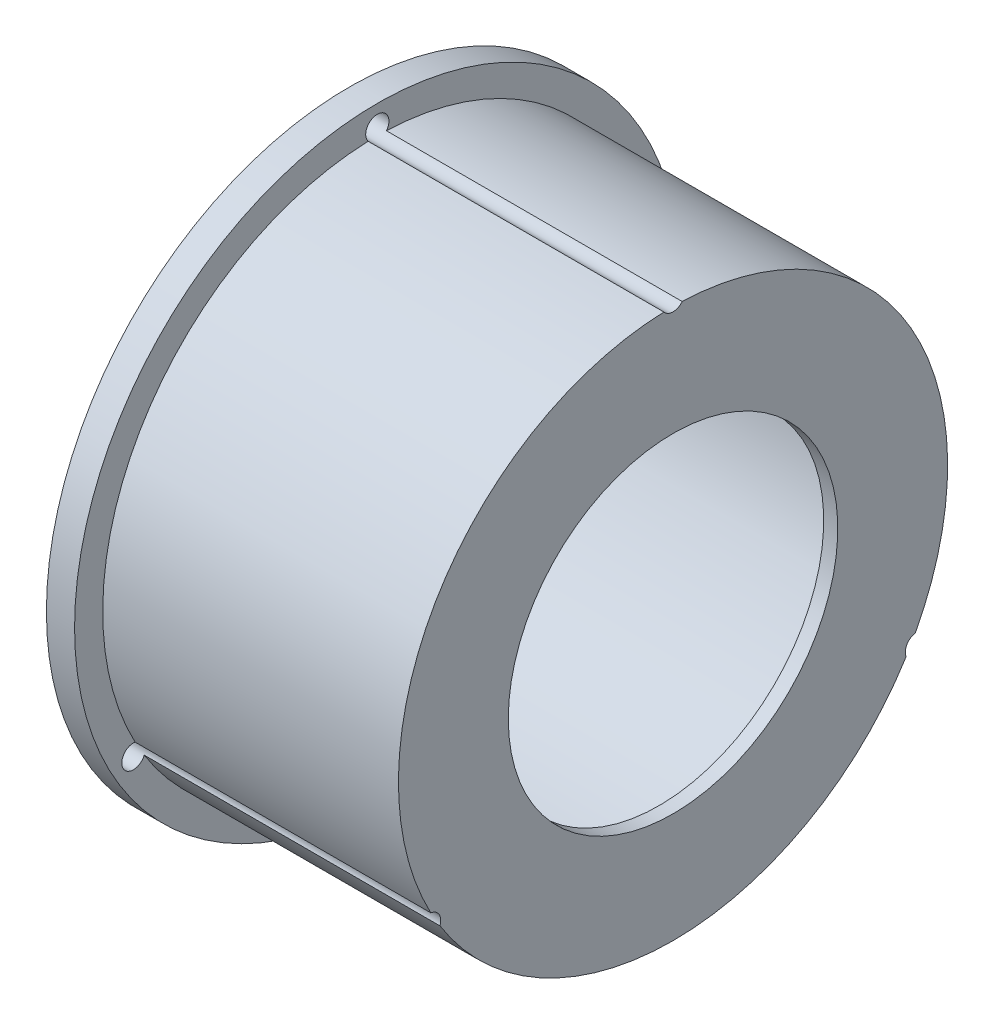
ISO-10303-21;
HEADER;
FILE_DESCRIPTION(('STEP AP214'),'2;1');
FILE_NAME('part.step','',(''),(''),'','','');
FILE_SCHEMA(('AUTOMOTIVE_DESIGN { 1 0 10303 214 1 1 1 1 }'));
ENDSEC;
DATA;
#1=APPLICATION_CONTEXT('core data for automotive mechanical design processes');
#2=APPLICATION_PROTOCOL_DEFINITION('international standard','automotive_design',2000,#1);
#3=PRODUCT_CONTEXT('',#1,'mechanical');
#4=PRODUCT('Part','Part','',(#3));
#5=PRODUCT_RELATED_PRODUCT_CATEGORY('part','',(#4));
#6=PRODUCT_DEFINITION_FORMATION('','',#4);
#7=PRODUCT_DEFINITION_CONTEXT('part definition',#1,'design');
#8=PRODUCT_DEFINITION('design','',#6,#7);
#9=PRODUCT_DEFINITION_SHAPE('','',#8);
#10=(LENGTH_UNIT() NAMED_UNIT(*) SI_UNIT(.MILLI.,.METRE.));
#11=(NAMED_UNIT(*) PLANE_ANGLE_UNIT() SI_UNIT($,.RADIAN.));
#12=(NAMED_UNIT(*) SI_UNIT($,.STERADIAN.) SOLID_ANGLE_UNIT());
#13=UNCERTAINTY_MEASURE_WITH_UNIT(LENGTH_MEASURE(1.E-05),#10,'distance_accuracy_value','');
#14=(GEOMETRIC_REPRESENTATION_CONTEXT(3) GLOBAL_UNCERTAINTY_ASSIGNED_CONTEXT((#13)) GLOBAL_UNIT_ASSIGNED_CONTEXT((#10,
#11,#12)) REPRESENTATION_CONTEXT('',''));
#15=CARTESIAN_POINT('',(0.,0.,0.));
#16=DIRECTION('',(0.,0.,1.));
#17=DIRECTION('',(1.,0.,0.));
#18=AXIS2_PLACEMENT_3D('',#15,#16,#17);
#19=CARTESIAN_POINT('',(-110.,0.,0.));
#20=DIRECTION('',(-1.,0.,0.));
#21=DIRECTION('',(0.,0.,1.));
#22=AXIS2_PLACEMENT_3D('',#19,#20,#21);
#23=CYLINDRICAL_SURFACE('',#22,39.);
#24=DIRECTION('',(-1.,0.,0.));
#25=VECTOR('',#24,1.);
#26=CARTESIAN_POINT('',(90.85,38.9784687500001,-1.29575225458943));
#27=LINE('',#26,#25);
#28=CARTESIAN_POINT('',(181.7,38.97846875,-1.29575225458937));
#29=VERTEX_POINT('',#28);
#30=CARTESIAN_POINT('',(139.7,38.97846875,-1.29575225458954));
#31=VERTEX_POINT('',#30);
#32=EDGE_CURVE('E108',#29,#31,#27,.T.);
#33=ORIENTED_EDGE('',*,*,#32,.F.);
#34=CARTESIAN_POINT('',(181.7,0.,0.));
#35=DIRECTION('',(-1.,0.,0.));
#36=DIRECTION('',(0.,0.,1.));
#37=AXIS2_PLACEMENT_3D('',#34,#35,#36);
#38=CIRCLE('',#37,39.);
#39=CARTESIAN_POINT('',(181.7,-18.3670800055147,-34.4042202654125));
#40=VERTEX_POINT('',#39);
#41=EDGE_CURVE('E101',#29,#40,#38,.T.);
#42=ORIENTED_EDGE('',*,*,#41,.T.);
#43=DIRECTION('',(-1.,0.,0.));
#44=VECTOR('',#43,1.);
#45=CARTESIAN_POINT('',(90.85,-18.3670800055146,-34.4042202654126));
#46=LINE('',#45,#44);
#47=CARTESIAN_POINT('',(139.7,-18.3670800055145,-34.4042202654126));
#48=VERTEX_POINT('',#47);
#49=EDGE_CURVE('E83',#48,#40,#46,.F.);
#50=ORIENTED_EDGE('',*,*,#49,.F.);
#51=CARTESIAN_POINT('',(139.7,0.,0.));
#52=DIRECTION('',(-1.,0.,0.));
#53=DIRECTION('',(0.,0.,1.));
#54=AXIS2_PLACEMENT_3D('',#51,#52,#53);
#55=CIRCLE('',#54,39.);
#56=EDGE_CURVE('E117',#31,#48,#55,.T.);
#57=ORIENTED_EDGE('',*,*,#56,.F.);
#58=EDGE_LOOP('',(#33,#42,#50,#57));
#59=FACE_BOUND('',#58,.T.);
#60=ADVANCED_FACE('F33',(#59),#23,.T.);
#61=DIRECTION('',(-1.,0.,0.));
#62=VECTOR('',#61,1.);
#63=CARTESIAN_POINT('',(90.85,38.9784687500001,1.29575225458943));
#64=LINE('',#63,#62);
#65=CARTESIAN_POINT('',(139.7,38.97846875,1.29575225458954));
#66=VERTEX_POINT('',#65);
#67=CARTESIAN_POINT('',(181.7,38.97846875,1.29575225458937));
#68=VERTEX_POINT('',#67);
#69=EDGE_CURVE('E141',#66,#68,#64,.F.);
#70=ORIENTED_EDGE('',*,*,#69,.F.);
#71=CARTESIAN_POINT('',(139.7,-18.3670800055145,34.4042202654126));
#72=VERTEX_POINT('',#71);
#73=EDGE_CURVE('E122',#72,#66,#55,.T.);
#74=ORIENTED_EDGE('',*,*,#73,.F.);
#75=DIRECTION('',(-1.,0.,0.));
#76=VECTOR('',#75,1.);
#77=CARTESIAN_POINT('',(90.85,-18.3670800055146,34.4042202654127));
#78=LINE('',#77,#76);
#79=CARTESIAN_POINT('',(181.7,-18.3670800055146,34.4042202654126));
#80=VERTEX_POINT('',#79);
#81=EDGE_CURVE('E48',#80,#72,#78,.T.);
#82=ORIENTED_EDGE('',*,*,#81,.F.);
#83=EDGE_CURVE('E111',#80,#68,#38,.T.);
#84=ORIENTED_EDGE('',*,*,#83,.T.);
#85=EDGE_LOOP('',(#70,#74,#82,#84));
#86=FACE_BOUND('',#85,.T.);
#87=ADVANCED_FACE('F203',(#86),#23,.T.);
#88=DIRECTION('',(-1.,0.,0.));
#89=VECTOR('',#88,1.);
#90=CARTESIAN_POINT('',(90.85,-20.6113887444854,33.1084680108232));
#91=LINE('',#90,#89);
#92=CARTESIAN_POINT('',(139.7,-20.6113887444855,33.1084680108231));
#93=VERTEX_POINT('',#92);
#94=CARTESIAN_POINT('',(181.7,-20.6113887444853,33.1084680108232));
#95=VERTEX_POINT('',#94);
#96=EDGE_CURVE('E147',#93,#95,#91,.F.);
#97=ORIENTED_EDGE('',*,*,#96,.F.);
#98=CARTESIAN_POINT('',(139.7,-20.6113887444855,-33.1084680108231));
#99=VERTEX_POINT('',#98);
#100=EDGE_CURVE('E121',#99,#93,#55,.T.);
#101=ORIENTED_EDGE('',*,*,#100,.F.);
#102=DIRECTION('',(-1.,0.,0.));
#103=VECTOR('',#102,1.);
#104=CARTESIAN_POINT('',(90.85,-20.6113887444855,-33.1084680108232));
#105=LINE('',#104,#103);
#106=CARTESIAN_POINT('',(181.7,-20.6113887444854,-33.1084680108232));
#107=VERTEX_POINT('',#106);
#108=EDGE_CURVE('E56',#107,#99,#105,.T.);
#109=ORIENTED_EDGE('',*,*,#108,.F.);
#110=EDGE_CURVE('E104',#107,#95,#38,.T.);
#111=ORIENTED_EDGE('',*,*,#110,.T.);
#112=EDGE_LOOP('',(#97,#101,#109,#111));
#113=FACE_BOUND('',#112,.T.);
#114=ADVANCED_FACE('F159',(#113),#23,.T.);
#115=CARTESIAN_POINT('',(135.7,43.,0.));
#116=DIRECTION('',(1.,0.,0.));
#117=DIRECTION('',(0.,0.,-1.));
#118=AXIS2_PLACEMENT_3D('',#115,#116,#117);
#119=PLANE('',#118);
#120=CARTESIAN_POINT('',(135.7,40.,0.));
#121=DIRECTION('',(1.,0.,0.));
#122=DIRECTION('',(0.,0.,-1.));
#123=AXIS2_PLACEMENT_3D('',#120,#121,#122);
#124=CIRCLE('',#123,1.65);
#125=CARTESIAN_POINT('',(135.7,40.,-1.65));
#126=VERTEX_POINT('',#125);
#127=EDGE_CURVE('E135',#126,#126,#124,.F.);
#128=ORIENTED_EDGE('',*,*,#127,.F.);
#129=EDGE_LOOP('',(#128));
#130=FACE_BOUND('',#129,.T.);
#131=CARTESIAN_POINT('',(135.7,-20.,34.6410161513775));
#132=DIRECTION('',(1.,0.,0.));
#133=DIRECTION('',(0.,0.,-1.));
#134=AXIS2_PLACEMENT_3D('',#131,#132,#133);
#135=CIRCLE('',#134,1.65);
#136=CARTESIAN_POINT('',(135.7,-20.,32.9910161513776));
#137=VERTEX_POINT('',#136);
#138=EDGE_CURVE('E143',#137,#137,#135,.F.);
#139=ORIENTED_EDGE('',*,*,#138,.F.);
#140=EDGE_LOOP('',(#139));
#141=FACE_BOUND('',#140,.T.);
#142=CARTESIAN_POINT('',(135.7,-20.,-34.6410161513775));
#143=DIRECTION('',(1.,0.,0.));
#144=DIRECTION('',(0.,0.,-1.));
#145=AXIS2_PLACEMENT_3D('',#142,#143,#144);
#146=CIRCLE('',#145,1.65);
#147=CARTESIAN_POINT('',(135.7,-20.,-36.2910161513775));
#148=VERTEX_POINT('',#147);
#149=EDGE_CURVE('E149',#148,#148,#146,.F.);
#150=ORIENTED_EDGE('',*,*,#149,.F.);
#151=EDGE_LOOP('',(#150));
#152=FACE_BOUND('',#151,.T.);
#153=CARTESIAN_POINT('',(135.7,0.,0.));
#154=DIRECTION('',(-1.,0.,0.));
#155=DIRECTION('',(0.,0.,1.));
#156=AXIS2_PLACEMENT_3D('',#153,#154,#155);
#157=CIRCLE('',#156,36.4);
#158=CARTESIAN_POINT('',(135.7,0.,36.4));
#159=VERTEX_POINT('',#158);
#160=EDGE_CURVE('E163',#159,#159,#157,.T.);
#161=ORIENTED_EDGE('',*,*,#160,.F.);
#162=EDGE_LOOP('',(#161));
#163=FACE_BOUND('',#162,.T.);
#164=CARTESIAN_POINT('',(135.7,0.,0.));
#165=DIRECTION('',(-1.,0.,0.));
#166=DIRECTION('',(0.,0.,1.));
#167=AXIS2_PLACEMENT_3D('',#164,#165,#166);
#168=CIRCLE('',#167,43.);
#169=CARTESIAN_POINT('',(135.7,0.,43.));
#170=VERTEX_POINT('',#169);
#171=EDGE_CURVE('E131',#170,#170,#168,.T.);
#172=ORIENTED_EDGE('',*,*,#171,.T.);
#173=EDGE_LOOP('',(#172));
#174=FACE_BOUND('',#173,.T.);
#175=ADVANCED_FACE('F35',(#130,#141,#152,#163,#174),#119,.F.);
#176=CARTESIAN_POINT('',(-110.,0.,0.));
#177=DIRECTION('',(-1.,0.,0.));
#178=DIRECTION('',(0.,0.,1.));
#179=AXIS2_PLACEMENT_3D('',#176,#177,#178);
#180=CYLINDRICAL_SURFACE('',#179,36.4);
#181=CARTESIAN_POINT('',(179.7,0.,0.));
#182=DIRECTION('',(-1.,0.,0.));
#183=DIRECTION('',(0.,0.,1.));
#184=AXIS2_PLACEMENT_3D('',#181,#182,#183);
#185=CIRCLE('',#184,36.4);
#186=CARTESIAN_POINT('',(179.7,0.,36.4));
#187=VERTEX_POINT('',#186);
#188=EDGE_CURVE('E166',#187,#187,#185,.T.);
#189=ORIENTED_EDGE('',*,*,#188,.F.);
#190=EDGE_LOOP('',(#189));
#191=FACE_BOUND('',#190,.T.);
#192=ORIENTED_EDGE('',*,*,#160,.T.);
#193=EDGE_LOOP('',(#192));
#194=FACE_BOUND('',#193,.T.);
#195=ADVANCED_FACE('F179',(#191,#194),#180,.F.);
#196=CARTESIAN_POINT('',(179.7,36.4,0.));
#197=DIRECTION('',(1.,0.,0.));
#198=DIRECTION('',(0.,0.,-1.));
#199=AXIS2_PLACEMENT_3D('',#196,#197,#198);
#200=PLANE('',#199);
#201=CARTESIAN_POINT('',(179.7,0.,0.));
#202=DIRECTION('',(-1.,0.,0.));
#203=DIRECTION('',(0.,0.,1.));
#204=AXIS2_PLACEMENT_3D('',#201,#202,#203);
#205=CIRCLE('',#204,23.4);
#206=CARTESIAN_POINT('',(179.7,0.,23.4));
#207=VERTEX_POINT('',#206);
#208=EDGE_CURVE('E113',#207,#207,#205,.T.);
#209=ORIENTED_EDGE('',*,*,#208,.F.);
#210=EDGE_LOOP('',(#209));
#211=FACE_BOUND('',#210,.T.);
#212=ORIENTED_EDGE('',*,*,#188,.T.);
#213=EDGE_LOOP('',(#212));
#214=FACE_BOUND('',#213,.T.);
#215=ADVANCED_FACE('F176',(#211,#214),#200,.F.);
#216=CARTESIAN_POINT('',(-110.,0.,0.));
#217=DIRECTION('',(-1.,0.,0.));
#218=DIRECTION('',(0.,0.,1.));
#219=AXIS2_PLACEMENT_3D('',#216,#217,#218);
#220=CYLINDRICAL_SURFACE('',#219,23.4);
#221=CARTESIAN_POINT('',(181.7,0.,0.));
#222=DIRECTION('',(-1.,0.,0.));
#223=DIRECTION('',(0.,0.,1.));
#224=AXIS2_PLACEMENT_3D('',#221,#222,#223);
#225=CIRCLE('',#224,23.4);
#226=CARTESIAN_POINT('',(181.7,0.,23.4));
#227=VERTEX_POINT('',#226);
#228=EDGE_CURVE('E109',#227,#227,#225,.T.);
#229=ORIENTED_EDGE('',*,*,#228,.F.);
#230=EDGE_LOOP('',(#229));
#231=FACE_BOUND('',#230,.T.);
#232=ORIENTED_EDGE('',*,*,#208,.T.);
#233=EDGE_LOOP('',(#232));
#234=FACE_BOUND('',#233,.T.);
#235=ADVANCED_FACE('F174',(#231,#234),#220,.F.);
#236=CARTESIAN_POINT('',(181.7,23.4,0.));
#237=DIRECTION('',(-1.,0.,0.));
#238=DIRECTION('',(0.,0.,1.));
#239=AXIS2_PLACEMENT_3D('',#236,#237,#238);
#240=PLANE('',#239);
#241=CARTESIAN_POINT('',(181.7,40.,0.));
#242=DIRECTION('',(1.,0.,0.));
#243=DIRECTION('',(0.,0.,-1.));
#244=AXIS2_PLACEMENT_3D('',#241,#242,#243);
#245=CIRCLE('',#244,1.65);
#246=EDGE_CURVE('E93',#68,#29,#245,.T.);
#247=ORIENTED_EDGE('',*,*,#246,.F.);
#248=ORIENTED_EDGE('',*,*,#83,.F.);
#249=CARTESIAN_POINT('',(181.7,-20.,34.6410161513775));
#250=DIRECTION('',(1.,0.,0.));
#251=DIRECTION('',(0.,0.,-1.));
#252=AXIS2_PLACEMENT_3D('',#249,#250,#251);
#253=CIRCLE('',#252,1.65);
#254=EDGE_CURVE('E105',#95,#80,#253,.T.);
#255=ORIENTED_EDGE('',*,*,#254,.F.);
#256=ORIENTED_EDGE('',*,*,#110,.F.);
#257=CARTESIAN_POINT('',(181.7,-20.,-34.6410161513775));
#258=DIRECTION('',(1.,0.,0.));
#259=DIRECTION('',(0.,0.,-1.));
#260=AXIS2_PLACEMENT_3D('',#257,#258,#259);
#261=CIRCLE('',#260,1.65);
#262=EDGE_CURVE('E87',#40,#107,#261,.T.);
#263=ORIENTED_EDGE('',*,*,#262,.F.);
#264=ORIENTED_EDGE('',*,*,#41,.F.);
#265=EDGE_LOOP('',(#247,#248,#255,#256,#263,#264));
#266=FACE_BOUND('',#265,.T.);
#267=ORIENTED_EDGE('',*,*,#228,.T.);
#268=EDGE_LOOP('',(#267));
#269=FACE_BOUND('',#268,.T.);
#270=ADVANCED_FACE('F99',(#266,#269),#240,.F.);
#271=CARTESIAN_POINT('',(139.7,39.,0.));
#272=DIRECTION('',(-1.,0.,0.));
#273=DIRECTION('',(0.,0.,1.));
#274=AXIS2_PLACEMENT_3D('',#271,#272,#273);
#275=PLANE('',#274);
#276=CARTESIAN_POINT('',(139.7,40.,0.));
#277=DIRECTION('',(-1.,0.,0.));
#278=DIRECTION('',(0.,0.,1.));
#279=AXIS2_PLACEMENT_3D('',#276,#277,#278);
#280=CIRCLE('',#279,1.65);
#281=EDGE_CURVE('E11',#31,#66,#280,.F.);
#282=ORIENTED_EDGE('',*,*,#281,.F.);
#283=ORIENTED_EDGE('',*,*,#56,.T.);
#284=CARTESIAN_POINT('',(139.7,-20.,-34.6410161513775));
#285=DIRECTION('',(-1.,0.,0.));
#286=DIRECTION('',(0.,0.,1.));
#287=AXIS2_PLACEMENT_3D('',#284,#285,#286);
#288=CIRCLE('',#287,1.65);
#289=EDGE_CURVE('E88',#99,#48,#288,.F.);
#290=ORIENTED_EDGE('',*,*,#289,.F.);
#291=ORIENTED_EDGE('',*,*,#100,.T.);
#292=CARTESIAN_POINT('',(139.7,-20.,34.6410161513775));
#293=DIRECTION('',(-1.,0.,0.));
#294=DIRECTION('',(0.,0.,1.));
#295=AXIS2_PLACEMENT_3D('',#292,#293,#294);
#296=CIRCLE('',#295,1.65);
#297=EDGE_CURVE('E41',#72,#93,#296,.F.);
#298=ORIENTED_EDGE('',*,*,#297,.F.);
#299=ORIENTED_EDGE('',*,*,#73,.T.);
#300=EDGE_LOOP('',(#282,#283,#290,#291,#298,#299));
#301=FACE_BOUND('',#300,.T.);
#302=CARTESIAN_POINT('',(139.7,0.,0.));
#303=DIRECTION('',(-1.,0.,0.));
#304=DIRECTION('',(0.,0.,1.));
#305=AXIS2_PLACEMENT_3D('',#302,#303,#304);
#306=CIRCLE('',#305,43.);
#307=CARTESIAN_POINT('',(139.7,0.,43.));
#308=VERTEX_POINT('',#307);
#309=EDGE_CURVE('E128',#308,#308,#306,.T.);
#310=ORIENTED_EDGE('',*,*,#309,.F.);
#311=EDGE_LOOP('',(#310));
#312=FACE_BOUND('',#311,.T.);
#313=ADVANCED_FACE('F161',(#301,#312),#275,.F.);
#314=CARTESIAN_POINT('',(-110.,0.,0.));
#315=DIRECTION('',(-1.,0.,0.));
#316=DIRECTION('',(0.,0.,1.));
#317=AXIS2_PLACEMENT_3D('',#314,#315,#316);
#318=CYLINDRICAL_SURFACE('',#317,43.);
#319=ORIENTED_EDGE('',*,*,#171,.F.);
#320=EDGE_LOOP('',(#319));
#321=FACE_BOUND('',#320,.T.);
#322=ORIENTED_EDGE('',*,*,#309,.T.);
#323=EDGE_LOOP('',(#322));
#324=FACE_BOUND('',#323,.T.);
#325=ADVANCED_FACE('F192',(#321,#324),#318,.T.);
#326=CARTESIAN_POINT('',(135.7,-20.,-34.6410161513775));
#327=DIRECTION('',(-1.,0.,0.));
#328=DIRECTION('',(0.,0.,1.));
#329=AXIS2_PLACEMENT_3D('',#326,#327,#328);
#330=CYLINDRICAL_SURFACE('',#329,1.65);
#331=ORIENTED_EDGE('',*,*,#108,.T.);
#332=ORIENTED_EDGE('',*,*,#289,.T.);
#333=ORIENTED_EDGE('',*,*,#49,.T.);
#334=ORIENTED_EDGE('',*,*,#262,.T.);
#335=EDGE_LOOP('',(#331,#332,#333,#334));
#336=FACE_BOUND('',#335,.T.);
#337=ORIENTED_EDGE('',*,*,#149,.T.);
#338=EDGE_LOOP('',(#337));
#339=FACE_BOUND('',#338,.T.);
#340=ADVANCED_FACE('F85',(#336,#339),#330,.F.);
#341=CARTESIAN_POINT('',(135.7,-20.,34.6410161513775));
#342=DIRECTION('',(-1.,0.,0.));
#343=DIRECTION('',(0.,0.,1.));
#344=AXIS2_PLACEMENT_3D('',#341,#342,#343);
#345=CYLINDRICAL_SURFACE('',#344,1.65);
#346=ORIENTED_EDGE('',*,*,#81,.T.);
#347=ORIENTED_EDGE('',*,*,#297,.T.);
#348=ORIENTED_EDGE('',*,*,#96,.T.);
#349=ORIENTED_EDGE('',*,*,#254,.T.);
#350=EDGE_LOOP('',(#346,#347,#348,#349));
#351=FACE_BOUND('',#350,.T.);
#352=ORIENTED_EDGE('',*,*,#138,.T.);
#353=EDGE_LOOP('',(#352));
#354=FACE_BOUND('',#353,.T.);
#355=ADVANCED_FACE('F199',(#351,#354),#345,.F.);
#356=CARTESIAN_POINT('',(135.7,40.,0.));
#357=DIRECTION('',(-1.,0.,0.));
#358=DIRECTION('',(0.,0.,1.));
#359=AXIS2_PLACEMENT_3D('',#356,#357,#358);
#360=CYLINDRICAL_SURFACE('',#359,1.65);
#361=ORIENTED_EDGE('',*,*,#32,.T.);
#362=ORIENTED_EDGE('',*,*,#281,.T.);
#363=ORIENTED_EDGE('',*,*,#69,.T.);
#364=ORIENTED_EDGE('',*,*,#246,.T.);
#365=EDGE_LOOP('',(#361,#362,#363,#364));
#366=FACE_BOUND('',#365,.T.);
#367=ORIENTED_EDGE('',*,*,#127,.T.);
#368=EDGE_LOOP('',(#367));
#369=FACE_BOUND('',#368,.T.);
#370=ADVANCED_FACE('F155',(#366,#369),#360,.F.);
#371=CLOSED_SHELL('',(#60,#87,#114,#175,#195,#215,#235,#270,#313,#325,#340,#355,#370));
#372=MANIFOLD_SOLID_BREP('B2',#371);
#373=ADVANCED_BREP_SHAPE_REPRESENTATION('',(#18,#372),#14);
#374=SHAPE_DEFINITION_REPRESENTATION(#9,#373);
ENDSEC;
END-ISO-10303-21;
